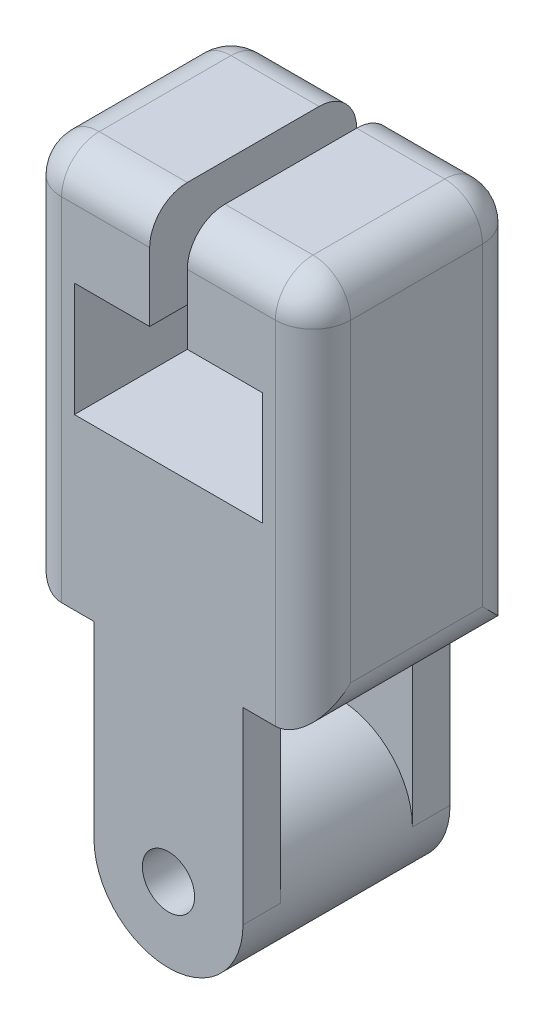
ISO-10303-21;
HEADER;
FILE_DESCRIPTION(('STEP AP214'),'2;1');
FILE_NAME('part.step','',(''),(''),'','','');
FILE_SCHEMA(('AUTOMOTIVE_DESIGN { 1 0 10303 214 1 1 1 1 }'));
ENDSEC;
DATA;
#1=APPLICATION_CONTEXT('core data for automotive mechanical design processes');
#2=APPLICATION_PROTOCOL_DEFINITION('international standard','automotive_design',2000,#1);
#3=PRODUCT_CONTEXT('',#1,'mechanical');
#4=PRODUCT('Part','Part','',(#3));
#5=PRODUCT_RELATED_PRODUCT_CATEGORY('part','',(#4));
#6=PRODUCT_DEFINITION_FORMATION('','',#4);
#7=PRODUCT_DEFINITION_CONTEXT('part definition',#1,'design');
#8=PRODUCT_DEFINITION('design','',#6,#7);
#9=PRODUCT_DEFINITION_SHAPE('','',#8);
#10=(LENGTH_UNIT() NAMED_UNIT(*) SI_UNIT(.MILLI.,.METRE.));
#11=(NAMED_UNIT(*) PLANE_ANGLE_UNIT() SI_UNIT($,.RADIAN.));
#12=(NAMED_UNIT(*) SI_UNIT($,.STERADIAN.) SOLID_ANGLE_UNIT());
#13=UNCERTAINTY_MEASURE_WITH_UNIT(LENGTH_MEASURE(1.E-05),#10,'distance_accuracy_value','');
#14=(GEOMETRIC_REPRESENTATION_CONTEXT(3) GLOBAL_UNCERTAINTY_ASSIGNED_CONTEXT((#13)) GLOBAL_UNIT_ASSIGNED_CONTEXT((#10,
#11,#12)) REPRESENTATION_CONTEXT('',''));
#15=CARTESIAN_POINT('',(0.,0.,0.));
#16=DIRECTION('',(0.,0.,1.));
#17=DIRECTION('',(1.,0.,0.));
#18=AXIS2_PLACEMENT_3D('',#15,#16,#17);
#19=CARTESIAN_POINT('',(0.,-131.318,69.85));
#20=DIRECTION('',(0.,1.,0.));
#21=DIRECTION('',(0.,0.,1.));
#22=AXIS2_PLACEMENT_3D('',#19,#20,#21);
#23=PLANE('',#22);
#24=DIRECTION('',(1.,0.,0.));
#25=VECTOR('',#24,1.);
#26=CARTESIAN_POINT('',(0.,-131.318,69.85));
#27=LINE('',#26,#25);
#28=CARTESIAN_POINT('',(12.7,-131.318,69.85));
#29=VERTEX_POINT('',#28);
#30=CARTESIAN_POINT('',(23.622,-131.318,69.85));
#31=VERTEX_POINT('',#30);
#32=EDGE_CURVE('E514',#29,#31,#27,.T.);
#33=ORIENTED_EDGE('',*,*,#32,.F.);
#34=DIRECTION('',(0.,0.,-1.));
#35=VECTOR('',#34,1.);
#36=CARTESIAN_POINT('',(12.7,-131.318,69.85));
#37=LINE('',#36,#35);
#38=CARTESIAN_POINT('',(12.7,-131.318,0.));
#39=VERTEX_POINT('',#38);
#40=EDGE_CURVE('E317',#29,#39,#37,.T.);
#41=ORIENTED_EDGE('',*,*,#40,.T.);
#42=DIRECTION('',(1.,0.,0.));
#43=VECTOR('',#42,1.);
#44=CARTESIAN_POINT('',(0.,-131.318,0.));
#45=LINE('',#44,#43);
#46=CARTESIAN_POINT('',(23.622,-131.318,0.));
#47=VERTEX_POINT('',#46);
#48=EDGE_CURVE('E564',#39,#47,#45,.T.);
#49=ORIENTED_EDGE('',*,*,#48,.T.);
#50=DIRECTION('',(0.,0.,-1.));
#51=VECTOR('',#50,1.);
#52=CARTESIAN_POINT('',(23.622,-131.318,0.));
#53=LINE('',#52,#51);
#54=CARTESIAN_POINT('',(23.622,-131.318,12.7));
#55=VERTEX_POINT('',#54);
#56=EDGE_CURVE('E604',#55,#47,#53,.T.);
#57=ORIENTED_EDGE('',*,*,#56,.F.);
#58=DIRECTION('',(-1.,0.,0.));
#59=VECTOR('',#58,1.);
#60=CARTESIAN_POINT('',(23.622,-131.318,12.7));
#61=LINE('',#60,#59);
#62=CARTESIAN_POINT('',(73.914,-131.318,12.7));
#63=VERTEX_POINT('',#62);
#64=EDGE_CURVE('E614',#63,#55,#61,.T.);
#65=ORIENTED_EDGE('',*,*,#64,.F.);
#66=DIRECTION('',(0.,0.,1.));
#67=VECTOR('',#66,1.);
#68=CARTESIAN_POINT('',(73.914,-131.318,12.7));
#69=LINE('',#68,#67);
#70=CARTESIAN_POINT('',(73.914,-131.318,0.));
#71=VERTEX_POINT('',#70);
#72=EDGE_CURVE('E606',#71,#63,#69,.T.);
#73=ORIENTED_EDGE('',*,*,#72,.F.);
#74=CARTESIAN_POINT('',(84.836,-131.318,0.));
#75=VERTEX_POINT('',#74);
#76=EDGE_CURVE('E255',#71,#75,#45,.T.);
#77=ORIENTED_EDGE('',*,*,#76,.T.);
#78=DIRECTION('',(0.,0.,-1.));
#79=VECTOR('',#78,1.);
#80=CARTESIAN_POINT('',(84.836,-131.318,69.85));
#81=LINE('',#80,#79);
#82=CARTESIAN_POINT('',(84.836,-131.318,69.85));
#83=VERTEX_POINT('',#82);
#84=EDGE_CURVE('E313',#75,#83,#81,.F.);
#85=ORIENTED_EDGE('',*,*,#84,.T.);
#86=CARTESIAN_POINT('',(73.914,-131.318,69.85));
#87=VERTEX_POINT('',#86);
#88=EDGE_CURVE('E510',#87,#83,#27,.T.);
#89=ORIENTED_EDGE('',*,*,#88,.F.);
#90=DIRECTION('',(0.,0.,1.));
#91=VECTOR('',#90,1.);
#92=CARTESIAN_POINT('',(73.914,-131.318,57.15));
#93=LINE('',#92,#91);
#94=CARTESIAN_POINT('',(73.914,-131.318,57.15));
#95=VERTEX_POINT('',#94);
#96=EDGE_CURVE('E250',#95,#87,#93,.T.);
#97=ORIENTED_EDGE('',*,*,#96,.F.);
#98=DIRECTION('',(1.,0.,0.));
#99=VECTOR('',#98,1.);
#100=CARTESIAN_POINT('',(23.622,-131.318,57.15));
#101=LINE('',#100,#99);
#102=CARTESIAN_POINT('',(23.622,-131.318,57.15));
#103=VERTEX_POINT('',#102);
#104=EDGE_CURVE('E264',#103,#95,#101,.T.);
#105=ORIENTED_EDGE('',*,*,#104,.F.);
#106=DIRECTION('',(0.,0.,-1.));
#107=VECTOR('',#106,1.);
#108=CARTESIAN_POINT('',(23.622,-131.318,69.85));
#109=LINE('',#108,#107);
#110=EDGE_CURVE('E641',#31,#103,#109,.T.);
#111=ORIENTED_EDGE('',*,*,#110,.F.);
#112=EDGE_LOOP('',(#33,#41,#49,#57,#65,#73,#77,#85,#89,#97,#105,#111));
#113=FACE_BOUND('',#112,.T.);
#114=ADVANCED_FACE('F55',(#113),#23,.F.);
#115=CARTESIAN_POINT('',(0.,0.,69.85));
#116=DIRECTION('',(1.,0.,0.));
#117=DIRECTION('',(0.,1.,0.));
#118=AXIS2_PLACEMENT_3D('',#115,#116,#117);
#119=PLANE('',#118);
#120=DIRECTION('',(0.,-1.,0.));
#121=VECTOR('',#120,1.);
#122=CARTESIAN_POINT('',(0.,0.,57.15));
#123=LINE('',#122,#121);
#124=CARTESIAN_POINT('',(0.,-118.618,57.15));
#125=VERTEX_POINT('',#124);
#126=CARTESIAN_POINT('',(0.,-12.7,57.15));
#127=VERTEX_POINT('',#126);
#128=EDGE_CURVE('E302',#125,#127,#123,.F.);
#129=ORIENTED_EDGE('',*,*,#128,.T.);
#130=DIRECTION('',(0.,0.,-1.));
#131=VECTOR('',#130,1.);
#132=CARTESIAN_POINT('',(0.,-12.7,69.85));
#133=LINE('',#132,#131);
#134=CARTESIAN_POINT('',(0.,-12.7,12.7));
#135=VERTEX_POINT('',#134);
#136=EDGE_CURVE('E309',#127,#135,#133,.T.);
#137=ORIENTED_EDGE('',*,*,#136,.T.);
#138=DIRECTION('',(0.,-1.,0.));
#139=VECTOR('',#138,1.);
#140=CARTESIAN_POINT('',(0.,0.,12.7));
#141=LINE('',#140,#139);
#142=CARTESIAN_POINT('',(0.,-118.618,12.7));
#143=VERTEX_POINT('',#142);
#144=EDGE_CURVE('E310',#135,#143,#141,.T.);
#145=ORIENTED_EDGE('',*,*,#144,.T.);
#146=DIRECTION('',(0.,0.,-1.));
#147=VECTOR('',#146,1.);
#148=CARTESIAN_POINT('',(0.,-118.618,69.85));
#149=LINE('',#148,#147);
#150=EDGE_CURVE('E301',#143,#125,#149,.F.);
#151=ORIENTED_EDGE('',*,*,#150,.T.);
#152=EDGE_LOOP('',(#129,#137,#145,#151));
#153=FACE_BOUND('',#152,.T.);
#154=ADVANCED_FACE('F679',(#153),#119,.F.);
#155=CARTESIAN_POINT('',(97.536,-131.318,69.85));
#156=DIRECTION('',(-1.,0.,0.));
#157=DIRECTION('',(0.,0.,1.));
#158=AXIS2_PLACEMENT_3D('',#155,#156,#157);
#159=PLANE('',#158);
#160=DIRECTION('',(0.,1.,0.));
#161=VECTOR('',#160,1.);
#162=CARTESIAN_POINT('',(97.536,-131.318,12.7));
#163=LINE('',#162,#161);
#164=CARTESIAN_POINT('',(97.536,-118.618,12.7));
#165=VERTEX_POINT('',#164);
#166=CARTESIAN_POINT('',(97.536,-12.7,12.7));
#167=VERTEX_POINT('',#166);
#168=EDGE_CURVE('E64',#165,#167,#163,.T.);
#169=ORIENTED_EDGE('',*,*,#168,.T.);
#170=DIRECTION('',(0.,0.,-1.));
#171=VECTOR('',#170,1.);
#172=CARTESIAN_POINT('',(97.536,-12.7,69.85));
#173=LINE('',#172,#171);
#174=CARTESIAN_POINT('',(97.536,-12.7,57.15));
#175=VERTEX_POINT('',#174);
#176=EDGE_CURVE('E12',#167,#175,#173,.F.);
#177=ORIENTED_EDGE('',*,*,#176,.T.);
#178=DIRECTION('',(0.,1.,0.));
#179=VECTOR('',#178,1.);
#180=CARTESIAN_POINT('',(97.536,-131.318,57.15));
#181=LINE('',#180,#179);
#182=CARTESIAN_POINT('',(97.536,-118.618,57.15));
#183=VERTEX_POINT('',#182);
#184=EDGE_CURVE('E322',#175,#183,#181,.F.);
#185=ORIENTED_EDGE('',*,*,#184,.T.);
#186=DIRECTION('',(0.,0.,-1.));
#187=VECTOR('',#186,1.);
#188=CARTESIAN_POINT('',(97.536,-118.618,69.85));
#189=LINE('',#188,#187);
#190=EDGE_CURVE('E318',#183,#165,#189,.T.);
#191=ORIENTED_EDGE('',*,*,#190,.T.);
#192=EDGE_LOOP('',(#169,#177,#185,#191));
#193=FACE_BOUND('',#192,.T.);
#194=ADVANCED_FACE('F681',(#193),#159,.F.);
#195=CARTESIAN_POINT('',(97.536,0.,69.85));
#196=DIRECTION('',(0.,-1.,0.));
#197=DIRECTION('',(1.,0.,0.));
#198=AXIS2_PLACEMENT_3D('',#195,#196,#197);
#199=PLANE('',#198);
#200=DIRECTION('',(0.,0.,-1.));
#201=VECTOR('',#200,1.);
#202=CARTESIAN_POINT('',(84.836,0.,69.85));
#203=LINE('',#202,#201);
#204=CARTESIAN_POINT('',(84.836,0.,57.15));
#205=VERTEX_POINT('',#204);
#206=CARTESIAN_POINT('',(84.836,0.,12.7));
#207=VERTEX_POINT('',#206);
#208=EDGE_CURVE('E415',#205,#207,#203,.T.);
#209=ORIENTED_EDGE('',*,*,#208,.T.);
#210=DIRECTION('',(-1.,0.,0.));
#211=VECTOR('',#210,1.);
#212=CARTESIAN_POINT('',(97.536,0.,12.7));
#213=LINE('',#212,#211);
#214=CARTESIAN_POINT('',(55.118,0.,12.7));
#215=VERTEX_POINT('',#214);
#216=EDGE_CURVE('E403',#207,#215,#213,.T.);
#217=ORIENTED_EDGE('',*,*,#216,.T.);
#218=DIRECTION('',(0.,0.,-1.));
#219=VECTOR('',#218,1.);
#220=CARTESIAN_POINT('',(55.118,0.,69.85));
#221=LINE('',#220,#219);
#222=CARTESIAN_POINT('',(55.118,0.,57.15));
#223=VERTEX_POINT('',#222);
#224=EDGE_CURVE('E442',#223,#215,#221,.T.);
#225=ORIENTED_EDGE('',*,*,#224,.F.);
#226=DIRECTION('',(-1.,0.,0.));
#227=VECTOR('',#226,1.);
#228=CARTESIAN_POINT('',(97.536,0.,57.15));
#229=LINE('',#228,#227);
#230=EDGE_CURVE('E410',#223,#205,#229,.F.);
#231=ORIENTED_EDGE('',*,*,#230,.T.);
#232=EDGE_LOOP('',(#209,#217,#225,#231));
#233=FACE_BOUND('',#232,.T.);
#234=ADVANCED_FACE('F745',(#233),#199,.F.);
#235=CARTESIAN_POINT('',(55.118,0.,69.85));
#236=DIRECTION('',(1.,0.,0.));
#237=DIRECTION('',(0.,0.,-1.));
#238=AXIS2_PLACEMENT_3D('',#235,#236,#237);
#239=PLANE('',#238);
#240=ORIENTED_EDGE('',*,*,#224,.T.);
#241=CARTESIAN_POINT('',(55.118,-12.7,12.7));
#242=DIRECTION('',(1.,0.,0.));
#243=DIRECTION('',(0.,0.,-1.));
#244=AXIS2_PLACEMENT_3D('',#241,#242,#243);
#245=CIRCLE('',#244,12.7);
#246=CARTESIAN_POINT('',(55.118,-12.7,0.));
#247=VERTEX_POINT('',#246);
#248=EDGE_CURVE('E399',#215,#247,#245,.F.);
#249=ORIENTED_EDGE('',*,*,#248,.T.);
#250=DIRECTION('',(0.,-1.,0.));
#251=VECTOR('',#250,1.);
#252=CARTESIAN_POINT('',(55.118,0.,0.));
#253=LINE('',#252,#251);
#254=CARTESIAN_POINT('',(55.118,-36.068,0.));
#255=VERTEX_POINT('',#254);
#256=EDGE_CURVE('E571',#247,#255,#253,.T.);
#257=ORIENTED_EDGE('',*,*,#256,.T.);
#258=DIRECTION('',(0.,0.,-1.));
#259=VECTOR('',#258,1.);
#260=CARTESIAN_POINT('',(55.118,-36.068,69.85));
#261=LINE('',#260,#259);
#262=CARTESIAN_POINT('',(55.118,-36.068,69.85));
#263=VERTEX_POINT('',#262);
#264=EDGE_CURVE('E450',#263,#255,#261,.T.);
#265=ORIENTED_EDGE('',*,*,#264,.F.);
#266=DIRECTION('',(0.,-1.,0.));
#267=VECTOR('',#266,1.);
#268=CARTESIAN_POINT('',(55.118,0.,69.85));
#269=LINE('',#268,#267);
#270=CARTESIAN_POINT('',(55.118,-12.7,69.85));
#271=VERTEX_POINT('',#270);
#272=EDGE_CURVE('E591',#271,#263,#269,.T.);
#273=ORIENTED_EDGE('',*,*,#272,.F.);
#274=CARTESIAN_POINT('',(55.118,-12.7,57.15));
#275=DIRECTION('',(1.,0.,0.));
#276=DIRECTION('',(0.,0.,-1.));
#277=AXIS2_PLACEMENT_3D('',#274,#275,#276);
#278=CIRCLE('',#277,12.7);
#279=EDGE_CURVE('E398',#271,#223,#278,.F.);
#280=ORIENTED_EDGE('',*,*,#279,.T.);
#281=EDGE_LOOP('',(#240,#249,#257,#265,#273,#280));
#282=FACE_BOUND('',#281,.T.);
#283=ADVANCED_FACE('F737',(#282),#239,.F.);
#284=CARTESIAN_POINT('',(55.118,-36.068,69.85));
#285=DIRECTION('',(0.,1.,0.));
#286=DIRECTION('',(0.,0.,1.));
#287=AXIS2_PLACEMENT_3D('',#284,#285,#286);
#288=PLANE('',#287);
#289=DIRECTION('',(1.,0.,0.));
#290=VECTOR('',#289,1.);
#291=CARTESIAN_POINT('',(55.118,-36.068,0.));
#292=LINE('',#291,#290);
#293=CARTESIAN_POINT('',(80.518,-36.068,0.));
#294=VERTEX_POINT('',#293);
#295=EDGE_CURVE('E472',#255,#294,#292,.T.);
#296=ORIENTED_EDGE('',*,*,#295,.T.);
#297=DIRECTION('',(0.,0.,-1.));
#298=VECTOR('',#297,1.);
#299=CARTESIAN_POINT('',(80.518,-36.068,69.85));
#300=LINE('',#299,#298);
#301=CARTESIAN_POINT('',(80.518,-36.068,69.85));
#302=VERTEX_POINT('',#301);
#303=EDGE_CURVE('E453',#302,#294,#300,.T.);
#304=ORIENTED_EDGE('',*,*,#303,.F.);
#305=DIRECTION('',(1.,0.,0.));
#306=VECTOR('',#305,1.);
#307=CARTESIAN_POINT('',(55.118,-36.068,69.85));
#308=LINE('',#307,#306);
#309=EDGE_CURVE('E587',#263,#302,#308,.T.);
#310=ORIENTED_EDGE('',*,*,#309,.F.);
#311=ORIENTED_EDGE('',*,*,#264,.T.);
#312=EDGE_LOOP('',(#296,#304,#310,#311));
#313=FACE_BOUND('',#312,.T.);
#314=ADVANCED_FACE('F752',(#313),#288,.F.);
#315=CARTESIAN_POINT('',(80.518,-36.068,69.85));
#316=DIRECTION('',(1.,0.,0.));
#317=DIRECTION('',(0.,0.,-1.));
#318=AXIS2_PLACEMENT_3D('',#315,#316,#317);
#319=PLANE('',#318);
#320=DIRECTION('',(0.,-1.,0.));
#321=VECTOR('',#320,1.);
#322=CARTESIAN_POINT('',(80.518,-36.068,0.));
#323=LINE('',#322,#321);
#324=CARTESIAN_POINT('',(80.518,-74.168,0.));
#325=VERTEX_POINT('',#324);
#326=EDGE_CURVE('E470',#294,#325,#323,.T.);
#327=ORIENTED_EDGE('',*,*,#326,.T.);
#328=DIRECTION('',(0.,0.,-1.));
#329=VECTOR('',#328,1.);
#330=CARTESIAN_POINT('',(80.518,-74.168,69.85));
#331=LINE('',#330,#329);
#332=CARTESIAN_POINT('',(80.518,-74.168,69.85));
#333=VERTEX_POINT('',#332);
#334=EDGE_CURVE('E458',#333,#325,#331,.T.);
#335=ORIENTED_EDGE('',*,*,#334,.F.);
#336=DIRECTION('',(0.,-1.,0.));
#337=VECTOR('',#336,1.);
#338=CARTESIAN_POINT('',(80.518,-36.068,69.85));
#339=LINE('',#338,#337);
#340=EDGE_CURVE('E590',#302,#333,#339,.T.);
#341=ORIENTED_EDGE('',*,*,#340,.F.);
#342=ORIENTED_EDGE('',*,*,#303,.T.);
#343=EDGE_LOOP('',(#327,#335,#341,#342));
#344=FACE_BOUND('',#343,.T.);
#345=ADVANCED_FACE('F757',(#344),#319,.F.);
#346=CARTESIAN_POINT('',(17.018,-74.168,69.85));
#347=DIRECTION('',(0.,-1.,0.));
#348=DIRECTION('',(0.,0.,-1.));
#349=AXIS2_PLACEMENT_3D('',#346,#347,#348);
#350=PLANE('',#349);
#351=DIRECTION('',(-1.,0.,0.));
#352=VECTOR('',#351,1.);
#353=CARTESIAN_POINT('',(17.018,-74.168,0.));
#354=LINE('',#353,#352);
#355=CARTESIAN_POINT('',(17.018,-74.168,0.));
#356=VERTEX_POINT('',#355);
#357=EDGE_CURVE('E474',#325,#356,#354,.T.);
#358=ORIENTED_EDGE('',*,*,#357,.T.);
#359=DIRECTION('',(0.,0.,-1.));
#360=VECTOR('',#359,1.);
#361=CARTESIAN_POINT('',(17.018,-74.168,69.85));
#362=LINE('',#361,#360);
#363=CARTESIAN_POINT('',(17.018,-74.168,69.85));
#364=VERTEX_POINT('',#363);
#365=EDGE_CURVE('E487',#364,#356,#362,.T.);
#366=ORIENTED_EDGE('',*,*,#365,.F.);
#367=DIRECTION('',(-1.,0.,0.));
#368=VECTOR('',#367,1.);
#369=CARTESIAN_POINT('',(17.018,-74.168,69.85));
#370=LINE('',#369,#368);
#371=EDGE_CURVE('E581',#333,#364,#370,.T.);
#372=ORIENTED_EDGE('',*,*,#371,.F.);
#373=ORIENTED_EDGE('',*,*,#334,.T.);
#374=EDGE_LOOP('',(#358,#366,#372,#373));
#375=FACE_BOUND('',#374,.T.);
#376=ADVANCED_FACE('F766',(#375),#350,.F.);
#377=CARTESIAN_POINT('',(17.018,-35.7449144536344,69.85));
#378=DIRECTION('',(-1.,0.,0.));
#379=DIRECTION('',(0.,-1.,0.));
#380=AXIS2_PLACEMENT_3D('',#377,#378,#379);
#381=PLANE('',#380);
#382=DIRECTION('',(0.,1.,0.));
#383=VECTOR('',#382,1.);
#384=CARTESIAN_POINT('',(17.018,-35.7449144536344,0.));
#385=LINE('',#384,#383);
#386=CARTESIAN_POINT('',(17.018,-35.7449144536344,0.));
#387=VERTEX_POINT('',#386);
#388=EDGE_CURVE('E476',#356,#387,#385,.T.);
#389=ORIENTED_EDGE('',*,*,#388,.T.);
#390=DIRECTION('',(0.,0.,-1.));
#391=VECTOR('',#390,1.);
#392=CARTESIAN_POINT('',(17.018,-35.7449144536344,69.85));
#393=LINE('',#392,#391);
#394=CARTESIAN_POINT('',(17.018,-35.7449144536344,69.85));
#395=VERTEX_POINT('',#394);
#396=EDGE_CURVE('E495',#395,#387,#393,.T.);
#397=ORIENTED_EDGE('',*,*,#396,.F.);
#398=DIRECTION('',(0.,1.,0.));
#399=VECTOR('',#398,1.);
#400=CARTESIAN_POINT('',(17.018,-35.7449144536344,69.85));
#401=LINE('',#400,#399);
#402=EDGE_CURVE('E584',#364,#395,#401,.T.);
#403=ORIENTED_EDGE('',*,*,#402,.F.);
#404=ORIENTED_EDGE('',*,*,#365,.T.);
#405=EDGE_LOOP('',(#389,#397,#403,#404));
#406=FACE_BOUND('',#405,.T.);
#407=ADVANCED_FACE('F767',(#406),#381,.F.);
#408=CARTESIAN_POINT('',(42.418,-35.7449144536344,69.85));
#409=DIRECTION('',(0.,1.,0.));
#410=DIRECTION('',(0.,0.,1.));
#411=AXIS2_PLACEMENT_3D('',#408,#409,#410);
#412=PLANE('',#411);
#413=DIRECTION('',(1.,0.,0.));
#414=VECTOR('',#413,1.);
#415=CARTESIAN_POINT('',(42.418,-35.7449144536344,0.));
#416=LINE('',#415,#414);
#417=CARTESIAN_POINT('',(42.418,-35.7449144536344,0.));
#418=VERTEX_POINT('',#417);
#419=EDGE_CURVE('E484',#387,#418,#416,.T.);
#420=ORIENTED_EDGE('',*,*,#419,.T.);
#421=DIRECTION('',(0.,0.,-1.));
#422=VECTOR('',#421,1.);
#423=CARTESIAN_POINT('',(42.418,-35.7449144536344,69.85));
#424=LINE('',#423,#422);
#425=CARTESIAN_POINT('',(42.418,-35.7449144536344,69.85));
#426=VERTEX_POINT('',#425);
#427=EDGE_CURVE('E496',#426,#418,#424,.T.);
#428=ORIENTED_EDGE('',*,*,#427,.F.);
#429=DIRECTION('',(1.,0.,0.));
#430=VECTOR('',#429,1.);
#431=CARTESIAN_POINT('',(42.418,-35.7449144536344,69.85));
#432=LINE('',#431,#430);
#433=EDGE_CURVE('E576',#395,#426,#432,.T.);
#434=ORIENTED_EDGE('',*,*,#433,.F.);
#435=ORIENTED_EDGE('',*,*,#396,.T.);
#436=EDGE_LOOP('',(#420,#428,#434,#435));
#437=FACE_BOUND('',#436,.T.);
#438=ADVANCED_FACE('F517',(#437),#412,.F.);
#439=CARTESIAN_POINT('',(42.418,0.,69.85));
#440=DIRECTION('',(-1.,0.,0.));
#441=DIRECTION('',(0.,0.,1.));
#442=AXIS2_PLACEMENT_3D('',#439,#440,#441);
#443=PLANE('',#442);
#444=DIRECTION('',(0.,1.,0.));
#445=VECTOR('',#444,1.);
#446=CARTESIAN_POINT('',(42.418,0.,0.));
#447=LINE('',#446,#445);
#448=CARTESIAN_POINT('',(42.418,-12.7,0.));
#449=VERTEX_POINT('',#448);
#450=EDGE_CURVE('E502',#418,#449,#447,.T.);
#451=ORIENTED_EDGE('',*,*,#450,.T.);
#452=CARTESIAN_POINT('',(42.418,-12.7,12.7));
#453=DIRECTION('',(-1.,0.,0.));
#454=DIRECTION('',(0.,0.,1.));
#455=AXIS2_PLACEMENT_3D('',#452,#453,#454);
#456=CIRCLE('',#455,12.7);
#457=CARTESIAN_POINT('',(42.418,0.,12.7));
#458=VERTEX_POINT('',#457);
#459=EDGE_CURVE('E412',#449,#458,#456,.F.);
#460=ORIENTED_EDGE('',*,*,#459,.T.);
#461=DIRECTION('',(0.,0.,-1.));
#462=VECTOR('',#461,1.);
#463=CARTESIAN_POINT('',(42.418,0.,69.85));
#464=LINE('',#463,#462);
#465=CARTESIAN_POINT('',(42.418,0.,57.15));
#466=VERTEX_POINT('',#465);
#467=EDGE_CURVE('E499',#466,#458,#464,.T.);
#468=ORIENTED_EDGE('',*,*,#467,.F.);
#469=CARTESIAN_POINT('',(42.418,-12.7,57.15));
#470=DIRECTION('',(-1.,0.,0.));
#471=DIRECTION('',(0.,0.,1.));
#472=AXIS2_PLACEMENT_3D('',#469,#470,#471);
#473=CIRCLE('',#472,12.7);
#474=CARTESIAN_POINT('',(42.418,-12.7,69.85));
#475=VERTEX_POINT('',#474);
#476=EDGE_CURVE('E420',#466,#475,#473,.F.);
#477=ORIENTED_EDGE('',*,*,#476,.T.);
#478=DIRECTION('',(0.,1.,0.));
#479=VECTOR('',#478,1.);
#480=CARTESIAN_POINT('',(42.418,0.,69.85));
#481=LINE('',#480,#479);
#482=EDGE_CURVE('E503',#426,#475,#481,.T.);
#483=ORIENTED_EDGE('',*,*,#482,.F.);
#484=ORIENTED_EDGE('',*,*,#427,.T.);
#485=EDGE_LOOP('',(#451,#460,#468,#477,#483,#484));
#486=FACE_BOUND('',#485,.T.);
#487=ADVANCED_FACE('F524',(#486),#443,.F.);
#488=CARTESIAN_POINT('',(0.,0.,69.85));
#489=DIRECTION('',(0.,-1.,0.));
#490=DIRECTION('',(0.,0.,-1.));
#491=AXIS2_PLACEMENT_3D('',#488,#489,#490);
#492=PLANE('',#491);
#493=ORIENTED_EDGE('',*,*,#467,.T.);
#494=DIRECTION('',(-1.,0.,0.));
#495=VECTOR('',#494,1.);
#496=CARTESIAN_POINT('',(0.,0.,12.7));
#497=LINE('',#496,#495);
#498=CARTESIAN_POINT('',(12.7,0.,12.7));
#499=VERTEX_POINT('',#498);
#500=EDGE_CURVE('E433',#458,#499,#497,.T.);
#501=ORIENTED_EDGE('',*,*,#500,.T.);
#502=DIRECTION('',(0.,0.,-1.));
#503=VECTOR('',#502,1.);
#504=CARTESIAN_POINT('',(12.7,0.,69.85));
#505=LINE('',#504,#503);
#506=CARTESIAN_POINT('',(12.7,0.,57.15));
#507=VERTEX_POINT('',#506);
#508=EDGE_CURVE('E439',#499,#507,#505,.F.);
#509=ORIENTED_EDGE('',*,*,#508,.T.);
#510=DIRECTION('',(-1.,0.,0.));
#511=VECTOR('',#510,1.);
#512=CARTESIAN_POINT('',(42.418,0.,57.15));
#513=LINE('',#512,#511);
#514=EDGE_CURVE('E440',#507,#466,#513,.F.);
#515=ORIENTED_EDGE('',*,*,#514,.T.);
#516=EDGE_LOOP('',(#493,#501,#509,#515));
#517=FACE_BOUND('',#516,.T.);
#518=ADVANCED_FACE('F542',(#517),#492,.F.);
#519=CARTESIAN_POINT('',(0.,0.,69.85));
#520=DIRECTION('',(0.,0.,1.));
#521=DIRECTION('',(1.,0.,0.));
#522=AXIS2_PLACEMENT_3D('',#519,#520,#521);
#523=PLANE('',#522);
#524=CARTESIAN_POINT('',(48.768,-194.818,69.85));
#525=DIRECTION('',(0.,0.,1.));
#526=DIRECTION('',(1.,0.,0.));
#527=AXIS2_PLACEMENT_3D('',#524,#525,#526);
#528=CIRCLE('',#527,8.80852099816562);
#529=CARTESIAN_POINT('',(57.5765209981657,-194.818,69.85));
#530=VERTEX_POINT('',#529);
#531=EDGE_CURVE('E276',#530,#530,#528,.T.);
#532=ORIENTED_EDGE('',*,*,#531,.F.);
#533=EDGE_LOOP('',(#532));
#534=FACE_BOUND('',#533,.T.);
#535=ORIENTED_EDGE('',*,*,#482,.T.);
#536=DIRECTION('',(-1.,0.,0.));
#537=VECTOR('',#536,1.);
#538=CARTESIAN_POINT('',(0.,-12.7,69.85));
#539=LINE('',#538,#537);
#540=CARTESIAN_POINT('',(12.7,-12.7,69.85));
#541=VERTEX_POINT('',#540);
#542=EDGE_CURVE('E298',#475,#541,#539,.T.);
#543=ORIENTED_EDGE('',*,*,#542,.T.);
#544=DIRECTION('',(0.,-1.,0.));
#545=VECTOR('',#544,1.);
#546=CARTESIAN_POINT('',(12.7,-131.318,69.85));
#547=LINE('',#546,#545);
#548=EDGE_CURVE('E293',#541,#29,#547,.T.);
#549=ORIENTED_EDGE('',*,*,#548,.T.);
#550=ORIENTED_EDGE('',*,*,#32,.T.);
#551=DIRECTION('',(0.,1.,0.));
#552=VECTOR('',#551,1.);
#553=CARTESIAN_POINT('',(23.622,-194.818,69.85));
#554=LINE('',#553,#552);
#555=CARTESIAN_POINT('',(23.622,-194.818,69.85));
#556=VERTEX_POINT('',#555);
#557=EDGE_CURVE('E254',#556,#31,#554,.T.);
#558=ORIENTED_EDGE('',*,*,#557,.F.);
#559=CARTESIAN_POINT('',(48.768,-194.818,69.85));
#560=DIRECTION('',(0.,0.,-1.));
#561=DIRECTION('',(-1.,0.,0.));
#562=AXIS2_PLACEMENT_3D('',#559,#560,#561);
#563=CIRCLE('',#562,25.146);
#564=CARTESIAN_POINT('',(73.914,-194.818,69.85));
#565=VERTEX_POINT('',#564);
#566=EDGE_CURVE('E256',#565,#556,#563,.T.);
#567=ORIENTED_EDGE('',*,*,#566,.F.);
#568=DIRECTION('',(0.,1.,0.));
#569=VECTOR('',#568,1.);
#570=CARTESIAN_POINT('',(73.914,-194.818,69.85));
#571=LINE('',#570,#569);
#572=EDGE_CURVE('E241',#565,#87,#571,.T.);
#573=ORIENTED_EDGE('',*,*,#572,.T.);
#574=ORIENTED_EDGE('',*,*,#88,.T.);
#575=DIRECTION('',(0.,1.,0.));
#576=VECTOR('',#575,1.);
#577=CARTESIAN_POINT('',(84.836,0.,69.85));
#578=LINE('',#577,#576);
#579=CARTESIAN_POINT('',(84.836,-12.7,69.85));
#580=VERTEX_POINT('',#579);
#581=EDGE_CURVE('E394',#83,#580,#578,.T.);
#582=ORIENTED_EDGE('',*,*,#581,.T.);
#583=DIRECTION('',(-1.,0.,0.));
#584=VECTOR('',#583,1.);
#585=CARTESIAN_POINT('',(55.118,-12.7,69.85));
#586=LINE('',#585,#584);
#587=EDGE_CURVE('E300',#580,#271,#586,.T.);
#588=ORIENTED_EDGE('',*,*,#587,.T.);
#589=ORIENTED_EDGE('',*,*,#272,.T.);
#590=ORIENTED_EDGE('',*,*,#309,.T.);
#591=ORIENTED_EDGE('',*,*,#340,.T.);
#592=ORIENTED_EDGE('',*,*,#371,.T.);
#593=ORIENTED_EDGE('',*,*,#402,.T.);
#594=ORIENTED_EDGE('',*,*,#433,.T.);
#595=EDGE_LOOP('',(#535,#543,#549,#550,#558,#567,#573,#574,#582,#588,#589,#590,#591,#592,#593,#594));
#596=FACE_BOUND('',#595,.T.);
#597=ADVANCED_FACE('F267',(#534,#596),#523,.T.);
#598=CARTESIAN_POINT('',(0.,0.,0.));
#599=DIRECTION('',(0.,0.,1.));
#600=DIRECTION('',(1.,0.,0.));
#601=AXIS2_PLACEMENT_3D('',#598,#599,#600);
#602=PLANE('',#601);
#603=CARTESIAN_POINT('',(48.768,-194.818,0.));
#604=DIRECTION('',(0.,0.,1.));
#605=DIRECTION('',(1.,0.,0.));
#606=AXIS2_PLACEMENT_3D('',#603,#604,#605);
#607=CIRCLE('',#606,8.80852099816562);
#608=CARTESIAN_POINT('',(57.5765209981657,-194.818,0.));
#609=VERTEX_POINT('',#608);
#610=EDGE_CURVE('E279',#609,#609,#607,.T.);
#611=ORIENTED_EDGE('',*,*,#610,.T.);
#612=EDGE_LOOP('',(#611));
#613=FACE_BOUND('',#612,.T.);
#614=DIRECTION('',(0.,-1.,0.));
#615=VECTOR('',#614,1.);
#616=CARTESIAN_POINT('',(12.7,0.,0.));
#617=LINE('',#616,#615);
#618=CARTESIAN_POINT('',(12.7,-12.7,0.));
#619=VERTEX_POINT('',#618);
#620=EDGE_CURVE('E425',#39,#619,#617,.F.);
#621=ORIENTED_EDGE('',*,*,#620,.T.);
#622=DIRECTION('',(-1.,0.,0.));
#623=VECTOR('',#622,1.);
#624=CARTESIAN_POINT('',(0.,-12.7,0.));
#625=LINE('',#624,#623);
#626=EDGE_CURVE('E423',#619,#449,#625,.F.);
#627=ORIENTED_EDGE('',*,*,#626,.T.);
#628=ORIENTED_EDGE('',*,*,#450,.F.);
#629=ORIENTED_EDGE('',*,*,#419,.F.);
#630=ORIENTED_EDGE('',*,*,#388,.F.);
#631=ORIENTED_EDGE('',*,*,#357,.F.);
#632=ORIENTED_EDGE('',*,*,#326,.F.);
#633=ORIENTED_EDGE('',*,*,#295,.F.);
#634=ORIENTED_EDGE('',*,*,#256,.F.);
#635=DIRECTION('',(-1.,0.,0.));
#636=VECTOR('',#635,1.);
#637=CARTESIAN_POINT('',(0.,-12.7,0.));
#638=LINE('',#637,#636);
#639=CARTESIAN_POINT('',(84.836,-12.7,0.));
#640=VERTEX_POINT('',#639);
#641=EDGE_CURVE('E430',#247,#640,#638,.F.);
#642=ORIENTED_EDGE('',*,*,#641,.T.);
#643=DIRECTION('',(0.,1.,0.));
#644=VECTOR('',#643,1.);
#645=CARTESIAN_POINT('',(84.836,0.,0.));
#646=LINE('',#645,#644);
#647=EDGE_CURVE('E427',#640,#75,#646,.F.);
#648=ORIENTED_EDGE('',*,*,#647,.T.);
#649=ORIENTED_EDGE('',*,*,#76,.F.);
#650=DIRECTION('',(0.,1.,0.));
#651=VECTOR('',#650,1.);
#652=CARTESIAN_POINT('',(73.914,-194.818,0.));
#653=LINE('',#652,#651);
#654=CARTESIAN_POINT('',(73.914,-194.818,0.));
#655=VERTEX_POINT('',#654);
#656=EDGE_CURVE('E610',#655,#71,#653,.T.);
#657=ORIENTED_EDGE('',*,*,#656,.F.);
#658=CARTESIAN_POINT('',(48.768,-194.818,0.));
#659=DIRECTION('',(0.,0.,-1.));
#660=DIRECTION('',(-1.,0.,0.));
#661=AXIS2_PLACEMENT_3D('',#658,#659,#660);
#662=CIRCLE('',#661,25.146);
#663=CARTESIAN_POINT('',(23.622,-194.818,0.));
#664=VERTEX_POINT('',#663);
#665=EDGE_CURVE('E268',#655,#664,#662,.T.);
#666=ORIENTED_EDGE('',*,*,#665,.T.);
#667=DIRECTION('',(0.,1.,0.));
#668=VECTOR('',#667,1.);
#669=CARTESIAN_POINT('',(23.622,-194.818,0.));
#670=LINE('',#669,#668);
#671=EDGE_CURVE('E567',#664,#47,#670,.T.);
#672=ORIENTED_EDGE('',*,*,#671,.T.);
#673=ORIENTED_EDGE('',*,*,#48,.F.);
#674=EDGE_LOOP('',(#621,#627,#628,#629,#630,#631,#632,#633,#634,#642,#648,#649,#657,#666,#672,#673));
#675=FACE_BOUND('',#674,.T.);
#676=ADVANCED_FACE('F522',(#613,#675),#602,.F.);
#677=CARTESIAN_POINT('',(73.914,-194.818,12.7));
#678=DIRECTION('',(-1.,0.,0.));
#679=DIRECTION('',(0.,0.,1.));
#680=AXIS2_PLACEMENT_3D('',#677,#678,#679);
#681=PLANE('',#680);
#682=ORIENTED_EDGE('',*,*,#72,.T.);
#683=DIRECTION('',(0.,1.,0.));
#684=VECTOR('',#683,1.);
#685=CARTESIAN_POINT('',(73.914,-194.818,12.7));
#686=LINE('',#685,#684);
#687=CARTESIAN_POINT('',(73.914,-194.818,12.7));
#688=VERTEX_POINT('',#687);
#689=EDGE_CURVE('E630',#688,#63,#686,.T.);
#690=ORIENTED_EDGE('',*,*,#689,.F.);
#691=DIRECTION('',(0.,0.,1.));
#692=VECTOR('',#691,1.);
#693=CARTESIAN_POINT('',(73.914,-194.818,12.7));
#694=LINE('',#693,#692);
#695=EDGE_CURVE('E596',#655,#688,#694,.T.);
#696=ORIENTED_EDGE('',*,*,#695,.F.);
#697=ORIENTED_EDGE('',*,*,#656,.T.);
#698=EDGE_LOOP('',(#682,#690,#696,#697));
#699=FACE_BOUND('',#698,.T.);
#700=ADVANCED_FACE('F658',(#699),#681,.F.);
#701=CARTESIAN_POINT('',(23.622,-194.818,12.7));
#702=DIRECTION('',(0.,0.,-1.));
#703=DIRECTION('',(-1.,0.,0.));
#704=AXIS2_PLACEMENT_3D('',#701,#702,#703);
#705=PLANE('',#704);
#706=DIRECTION('',(0.,1.,0.));
#707=VECTOR('',#706,1.);
#708=CARTESIAN_POINT('',(23.622,-194.818,12.7));
#709=LINE('',#708,#707);
#710=CARTESIAN_POINT('',(23.622,-194.818,12.7));
#711=VERTEX_POINT('',#710);
#712=EDGE_CURVE('E621',#711,#55,#709,.T.);
#713=ORIENTED_EDGE('',*,*,#712,.F.);
#714=CARTESIAN_POINT('',(48.768,-194.818,12.7));
#715=DIRECTION('',(0.,0.,-1.));
#716=DIRECTION('',(-1.,0.,0.));
#717=AXIS2_PLACEMENT_3D('',#714,#715,#716);
#718=CIRCLE('',#717,25.146);
#719=EDGE_CURVE('E274',#711,#688,#718,.T.);
#720=ORIENTED_EDGE('',*,*,#719,.T.);
#721=ORIENTED_EDGE('',*,*,#689,.T.);
#722=ORIENTED_EDGE('',*,*,#64,.T.);
#723=EDGE_LOOP('',(#713,#720,#721,#722));
#724=FACE_BOUND('',#723,.T.);
#725=ADVANCED_FACE('F657',(#724),#705,.F.);
#726=CARTESIAN_POINT('',(23.622,-194.818,0.));
#727=DIRECTION('',(1.,0.,0.));
#728=DIRECTION('',(0.,0.,-1.));
#729=AXIS2_PLACEMENT_3D('',#726,#727,#728);
#730=PLANE('',#729);
#731=ORIENTED_EDGE('',*,*,#56,.T.);
#732=ORIENTED_EDGE('',*,*,#671,.F.);
#733=DIRECTION('',(0.,0.,-1.));
#734=VECTOR('',#733,1.);
#735=CARTESIAN_POINT('',(23.622,-194.818,0.));
#736=LINE('',#735,#734);
#737=EDGE_CURVE('E602',#711,#664,#736,.T.);
#738=ORIENTED_EDGE('',*,*,#737,.F.);
#739=ORIENTED_EDGE('',*,*,#712,.T.);
#740=EDGE_LOOP('',(#731,#732,#738,#739));
#741=FACE_BOUND('',#740,.T.);
#742=ADVANCED_FACE('F663',(#741),#730,.F.);
#743=CARTESIAN_POINT('',(73.914,-194.818,57.15));
#744=DIRECTION('',(-1.,0.,0.));
#745=DIRECTION('',(0.,0.,1.));
#746=AXIS2_PLACEMENT_3D('',#743,#744,#745);
#747=PLANE('',#746);
#748=ORIENTED_EDGE('',*,*,#96,.T.);
#749=ORIENTED_EDGE('',*,*,#572,.F.);
#750=DIRECTION('',(0.,0.,1.));
#751=VECTOR('',#750,1.);
#752=CARTESIAN_POINT('',(73.914,-194.818,57.15));
#753=LINE('',#752,#751);
#754=CARTESIAN_POINT('',(73.914,-194.818,57.15));
#755=VERTEX_POINT('',#754);
#756=EDGE_CURVE('E244',#755,#565,#753,.T.);
#757=ORIENTED_EDGE('',*,*,#756,.F.);
#758=DIRECTION('',(0.,1.,0.));
#759=VECTOR('',#758,1.);
#760=CARTESIAN_POINT('',(73.914,-194.818,57.15));
#761=LINE('',#760,#759);
#762=EDGE_CURVE('E640',#755,#95,#761,.T.);
#763=ORIENTED_EDGE('',*,*,#762,.T.);
#764=EDGE_LOOP('',(#748,#749,#757,#763));
#765=FACE_BOUND('',#764,.T.);
#766=ADVANCED_FACE('F243',(#765),#747,.F.);
#767=CARTESIAN_POINT('',(23.622,-194.818,69.85));
#768=DIRECTION('',(1.,0.,0.));
#769=DIRECTION('',(0.,0.,-1.));
#770=AXIS2_PLACEMENT_3D('',#767,#768,#769);
#771=PLANE('',#770);
#772=ORIENTED_EDGE('',*,*,#110,.T.);
#773=DIRECTION('',(0.,1.,0.));
#774=VECTOR('',#773,1.);
#775=CARTESIAN_POINT('',(23.622,-194.818,57.15));
#776=LINE('',#775,#774);
#777=CARTESIAN_POINT('',(23.622,-194.818,57.15));
#778=VERTEX_POINT('',#777);
#779=EDGE_CURVE('E632',#778,#103,#776,.T.);
#780=ORIENTED_EDGE('',*,*,#779,.F.);
#781=DIRECTION('',(0.,0.,-1.));
#782=VECTOR('',#781,1.);
#783=CARTESIAN_POINT('',(23.622,-194.818,69.85));
#784=LINE('',#783,#782);
#785=EDGE_CURVE('E261',#556,#778,#784,.T.);
#786=ORIENTED_EDGE('',*,*,#785,.F.);
#787=ORIENTED_EDGE('',*,*,#557,.T.);
#788=EDGE_LOOP('',(#772,#780,#786,#787));
#789=FACE_BOUND('',#788,.T.);
#790=ADVANCED_FACE('F673',(#789),#771,.F.);
#791=CARTESIAN_POINT('',(23.622,-194.818,57.15));
#792=DIRECTION('',(0.,0.,1.));
#793=DIRECTION('',(1.,0.,0.));
#794=AXIS2_PLACEMENT_3D('',#791,#792,#793);
#795=PLANE('',#794);
#796=ORIENTED_EDGE('',*,*,#762,.F.);
#797=CARTESIAN_POINT('',(48.768,-194.818,57.15));
#798=DIRECTION('',(0.,0.,1.));
#799=DIRECTION('',(1.,0.,0.));
#800=AXIS2_PLACEMENT_3D('',#797,#798,#799);
#801=CIRCLE('',#800,25.146);
#802=EDGE_CURVE('E263',#755,#778,#801,.T.);
#803=ORIENTED_EDGE('',*,*,#802,.T.);
#804=ORIENTED_EDGE('',*,*,#779,.T.);
#805=ORIENTED_EDGE('',*,*,#104,.T.);
#806=EDGE_LOOP('',(#796,#803,#804,#805));
#807=FACE_BOUND('',#806,.T.);
#808=ADVANCED_FACE('F818',(#807),#795,.F.);
#809=CARTESIAN_POINT('',(48.768,-194.818,69.85));
#810=DIRECTION('',(0.,0.,-1.));
#811=DIRECTION('',(-1.,0.,0.));
#812=AXIS2_PLACEMENT_3D('',#809,#810,#811);
#813=CYLINDRICAL_SURFACE('',#812,25.146);
#814=ORIENTED_EDGE('',*,*,#566,.T.);
#815=ORIENTED_EDGE('',*,*,#785,.T.);
#816=ORIENTED_EDGE('',*,*,#802,.F.);
#817=ORIENTED_EDGE('',*,*,#756,.T.);
#818=EDGE_LOOP('',(#814,#815,#816,#817));
#819=FACE_BOUND('',#818,.T.);
#820=ORIENTED_EDGE('',*,*,#695,.T.);
#821=ORIENTED_EDGE('',*,*,#719,.F.);
#822=ORIENTED_EDGE('',*,*,#737,.T.);
#823=ORIENTED_EDGE('',*,*,#665,.F.);
#824=EDGE_LOOP('',(#820,#821,#822,#823));
#825=FACE_BOUND('',#824,.T.);
#826=ADVANCED_FACE('F259',(#819,#825),#813,.T.);
#827=CARTESIAN_POINT('',(48.768,-194.818,0.));
#828=DIRECTION('',(0.,0.,1.));
#829=DIRECTION('',(1.,0.,0.));
#830=AXIS2_PLACEMENT_3D('',#827,#828,#829);
#831=CYLINDRICAL_SURFACE('',#830,8.80852099816562);
#832=ORIENTED_EDGE('',*,*,#610,.F.);
#833=EDGE_LOOP('',(#832));
#834=FACE_BOUND('',#833,.T.);
#835=ORIENTED_EDGE('',*,*,#531,.T.);
#836=EDGE_LOOP('',(#835));
#837=FACE_BOUND('',#836,.T.);
#838=ADVANCED_FACE('F709',(#834,#837),#831,.F.);
#839=CARTESIAN_POINT('',(0.,-12.7,57.15));
#840=DIRECTION('',(1.,0.,0.));
#841=DIRECTION('',(0.,0.,-1.));
#842=AXIS2_PLACEMENT_3D('',#839,#840,#841);
#843=CYLINDRICAL_SURFACE('',#842,12.7);
#844=ORIENTED_EDGE('',*,*,#476,.F.);
#845=ORIENTED_EDGE('',*,*,#514,.F.);
#846=CARTESIAN_POINT('',(12.7,-12.7,57.15));
#847=DIRECTION('',(-1.,0.,0.));
#848=DIRECTION('',(0.,0.,1.));
#849=AXIS2_PLACEMENT_3D('',#846,#847,#848);
#850=CIRCLE('',#849,12.7);
#851=EDGE_CURVE('E351',#541,#507,#850,.T.);
#852=ORIENTED_EDGE('',*,*,#851,.F.);
#853=ORIENTED_EDGE('',*,*,#542,.F.);
#854=EDGE_LOOP('',(#844,#845,#852,#853));
#855=FACE_BOUND('',#854,.T.);
#856=ADVANCED_FACE('F548',(#855),#843,.T.);
#857=CARTESIAN_POINT('',(12.7,0.,57.15));
#858=DIRECTION('',(0.,1.,0.));
#859=DIRECTION('',(-1.,0.,0.));
#860=AXIS2_PLACEMENT_3D('',#857,#858,#859);
#861=CYLINDRICAL_SURFACE('',#860,12.7);
#862=CARTESIAN_POINT('',(12.7,-118.618,57.15));
#863=DIRECTION('',(0.,-0.707106781186547,-0.707106781186547));
#864=DIRECTION('',(0.,0.707106781186547,-0.707106781186547));
#865=AXIS2_PLACEMENT_3D('',#862,#863,#864);
#866=ELLIPSE('',#865,17.9605122421383,12.7);
#867=EDGE_CURVE('E348',#29,#125,#866,.T.);
#868=ORIENTED_EDGE('',*,*,#867,.F.);
#869=ORIENTED_EDGE('',*,*,#548,.F.);
#870=CARTESIAN_POINT('',(12.7,-12.7,57.15));
#871=DIRECTION('',(0.,1.,0.));
#872=DIRECTION('',(-1.,0.,0.));
#873=AXIS2_PLACEMENT_3D('',#870,#871,#872);
#874=CIRCLE('',#873,12.7);
#875=EDGE_CURVE('E347',#127,#541,#874,.T.);
#876=ORIENTED_EDGE('',*,*,#875,.F.);
#877=ORIENTED_EDGE('',*,*,#128,.F.);
#878=EDGE_LOOP('',(#868,#869,#876,#877));
#879=FACE_BOUND('',#878,.T.);
#880=ADVANCED_FACE('F560',(#879),#861,.T.);
#881=CARTESIAN_POINT('',(12.7,-12.7,57.15));
#882=DIRECTION('',(0.,0.,1.));
#883=DIRECTION('',(1.,0.,0.));
#884=AXIS2_PLACEMENT_3D('',#881,#882,#883);
#885=SPHERICAL_SURFACE('',#884,12.7);
#886=ORIENTED_EDGE('',*,*,#875,.T.);
#887=ORIENTED_EDGE('',*,*,#851,.T.);
#888=CARTESIAN_POINT('',(12.7,-12.7,57.15));
#889=DIRECTION('',(0.,0.,1.));
#890=DIRECTION('',(1.,0.,0.));
#891=AXIS2_PLACEMENT_3D('',#888,#889,#890);
#892=CIRCLE('',#891,12.7);
#893=EDGE_CURVE('E344',#127,#507,#892,.F.);
#894=ORIENTED_EDGE('',*,*,#893,.F.);
#895=EDGE_LOOP('',(#886,#887,#894));
#896=FACE_BOUND('',#895,.T.);
#897=ADVANCED_FACE('F699',(#896),#885,.T.);
#898=CARTESIAN_POINT('',(12.7,-118.618,69.85));
#899=DIRECTION('',(0.,0.,-1.));
#900=DIRECTION('',(-1.,0.,0.));
#901=AXIS2_PLACEMENT_3D('',#898,#899,#900);
#902=CYLINDRICAL_SURFACE('',#901,12.7);
#903=ORIENTED_EDGE('',*,*,#867,.T.);
#904=ORIENTED_EDGE('',*,*,#150,.F.);
#905=CARTESIAN_POINT('',(12.7,-118.618,12.7));
#906=DIRECTION('',(0.,0.707106781186547,-0.707106781186547));
#907=DIRECTION('',(0.,-0.707106781186547,-0.707106781186547));
#908=AXIS2_PLACEMENT_3D('',#905,#906,#907);
#909=ELLIPSE('',#908,17.9605122421383,12.7);
#910=EDGE_CURVE('E336',#39,#143,#909,.T.);
#911=ORIENTED_EDGE('',*,*,#910,.F.);
#912=ORIENTED_EDGE('',*,*,#40,.F.);
#913=EDGE_LOOP('',(#903,#904,#911,#912));
#914=FACE_BOUND('',#913,.T.);
#915=ADVANCED_FACE('F563',(#914),#902,.T.);
#916=CARTESIAN_POINT('',(12.7,-12.7,69.85));
#917=DIRECTION('',(0.,0.,-1.));
#918=DIRECTION('',(-1.,0.,0.));
#919=AXIS2_PLACEMENT_3D('',#916,#917,#918);
#920=CYLINDRICAL_SURFACE('',#919,12.7);
#921=ORIENTED_EDGE('',*,*,#893,.T.);
#922=ORIENTED_EDGE('',*,*,#508,.F.);
#923=CARTESIAN_POINT('',(12.7,-12.7,12.7));
#924=DIRECTION('',(0.,0.,-1.));
#925=DIRECTION('',(-1.,0.,0.));
#926=AXIS2_PLACEMENT_3D('',#923,#924,#925);
#927=CIRCLE('',#926,12.7);
#928=EDGE_CURVE('E331',#135,#499,#927,.T.);
#929=ORIENTED_EDGE('',*,*,#928,.F.);
#930=ORIENTED_EDGE('',*,*,#136,.F.);
#931=EDGE_LOOP('',(#921,#922,#929,#930));
#932=FACE_BOUND('',#931,.T.);
#933=ADVANCED_FACE('F543',(#932),#920,.T.);
#934=CARTESIAN_POINT('',(12.7,0.,12.7));
#935=DIRECTION('',(0.,-1.,0.));
#936=DIRECTION('',(1.,0.,0.));
#937=AXIS2_PLACEMENT_3D('',#934,#935,#936);
#938=CYLINDRICAL_SURFACE('',#937,12.7);
#939=ORIENTED_EDGE('',*,*,#910,.T.);
#940=ORIENTED_EDGE('',*,*,#144,.F.);
#941=CARTESIAN_POINT('',(12.7,-12.7,12.7));
#942=DIRECTION('',(0.,1.,0.));
#943=DIRECTION('',(-1.,0.,0.));
#944=AXIS2_PLACEMENT_3D('',#941,#942,#943);
#945=CIRCLE('',#944,12.7);
#946=EDGE_CURVE('E332',#619,#135,#945,.T.);
#947=ORIENTED_EDGE('',*,*,#946,.F.);
#948=ORIENTED_EDGE('',*,*,#620,.F.);
#949=EDGE_LOOP('',(#939,#940,#947,#948));
#950=FACE_BOUND('',#949,.T.);
#951=ADVANCED_FACE('F693',(#950),#938,.T.);
#952=CARTESIAN_POINT('',(12.7,-12.7,12.7));
#953=DIRECTION('',(-1.,0.,0.));
#954=DIRECTION('',(0.,0.,1.));
#955=AXIS2_PLACEMENT_3D('',#952,#953,#954);
#956=SPHERICAL_SURFACE('',#955,12.7);
#957=ORIENTED_EDGE('',*,*,#946,.T.);
#958=ORIENTED_EDGE('',*,*,#928,.T.);
#959=CARTESIAN_POINT('',(12.7,-12.7,12.7));
#960=DIRECTION('',(-1.,0.,0.));
#961=DIRECTION('',(0.,0.,1.));
#962=AXIS2_PLACEMENT_3D('',#959,#960,#961);
#963=CIRCLE('',#962,12.7);
#964=EDGE_CURVE('E326',#619,#499,#963,.F.);
#965=ORIENTED_EDGE('',*,*,#964,.F.);
#966=EDGE_LOOP('',(#957,#958,#965));
#967=FACE_BOUND('',#966,.T.);
#968=ADVANCED_FACE('F533',(#967),#956,.T.);
#969=CARTESIAN_POINT('',(0.,-12.7,12.7));
#970=DIRECTION('',(-1.,0.,0.));
#971=DIRECTION('',(0.,0.,1.));
#972=AXIS2_PLACEMENT_3D('',#969,#970,#971);
#973=CYLINDRICAL_SURFACE('',#972,12.7);
#974=ORIENTED_EDGE('',*,*,#459,.F.);
#975=ORIENTED_EDGE('',*,*,#626,.F.);
#976=ORIENTED_EDGE('',*,*,#964,.T.);
#977=ORIENTED_EDGE('',*,*,#500,.F.);
#978=EDGE_LOOP('',(#974,#975,#976,#977));
#979=FACE_BOUND('',#978,.T.);
#980=ADVANCED_FACE('F535',(#979),#973,.T.);
#981=CARTESIAN_POINT('',(84.836,0.,57.15));
#982=DIRECTION('',(0.,-1.,0.));
#983=DIRECTION('',(0.,0.,-1.));
#984=AXIS2_PLACEMENT_3D('',#981,#982,#983);
#985=CYLINDRICAL_SURFACE('',#984,12.7);
#986=CARTESIAN_POINT('',(84.836,-12.7,57.15));
#987=DIRECTION('',(0.,1.,0.));
#988=DIRECTION('',(0.,0.,1.));
#989=AXIS2_PLACEMENT_3D('',#986,#987,#988);
#990=CIRCLE('',#989,12.7);
#991=EDGE_CURVE('E378',#580,#175,#990,.T.);
#992=ORIENTED_EDGE('',*,*,#991,.F.);
#993=ORIENTED_EDGE('',*,*,#581,.F.);
#994=CARTESIAN_POINT('',(84.836,-118.618,57.15));
#995=DIRECTION('',(0.,-0.707106781186547,-0.707106781186547));
#996=DIRECTION('',(0.,0.707106781186547,-0.707106781186547));
#997=AXIS2_PLACEMENT_3D('',#994,#995,#996);
#998=ELLIPSE('',#997,17.9605122421383,12.7);
#999=EDGE_CURVE('E57',#183,#83,#998,.T.);
#1000=ORIENTED_EDGE('',*,*,#999,.F.);
#1001=ORIENTED_EDGE('',*,*,#184,.F.);
#1002=EDGE_LOOP('',(#992,#993,#1000,#1001));
#1003=FACE_BOUND('',#1002,.T.);
#1004=ADVANCED_FACE('F53',(#1003),#985,.T.);
#1005=CARTESIAN_POINT('',(0.,-12.7,57.15));
#1006=DIRECTION('',(1.,0.,0.));
#1007=DIRECTION('',(0.,1.,0.));
#1008=AXIS2_PLACEMENT_3D('',#1005,#1006,#1007);
#1009=CYLINDRICAL_SURFACE('',#1008,12.7);
#1010=ORIENTED_EDGE('',*,*,#279,.F.);
#1011=ORIENTED_EDGE('',*,*,#587,.F.);
#1012=CARTESIAN_POINT('',(84.836,-12.7,57.15));
#1013=DIRECTION('',(1.,0.,0.));
#1014=DIRECTION('',(0.,0.,-1.));
#1015=AXIS2_PLACEMENT_3D('',#1012,#1013,#1014);
#1016=CIRCLE('',#1015,12.7);
#1017=EDGE_CURVE('E376',#205,#580,#1016,.T.);
#1018=ORIENTED_EDGE('',*,*,#1017,.F.);
#1019=ORIENTED_EDGE('',*,*,#230,.F.);
#1020=EDGE_LOOP('',(#1010,#1011,#1018,#1019));
#1021=FACE_BOUND('',#1020,.T.);
#1022=ADVANCED_FACE('F726',(#1021),#1009,.T.);
#1023=CARTESIAN_POINT('',(84.836,-118.618,69.85));
#1024=DIRECTION('',(0.,0.,-1.));
#1025=DIRECTION('',(-1.,0.,0.));
#1026=AXIS2_PLACEMENT_3D('',#1023,#1024,#1025);
#1027=CYLINDRICAL_SURFACE('',#1026,12.7);
#1028=ORIENTED_EDGE('',*,*,#999,.T.);
#1029=ORIENTED_EDGE('',*,*,#84,.F.);
#1030=CARTESIAN_POINT('',(84.836,-118.618,12.7));
#1031=DIRECTION('',(0.,0.707106781186547,-0.707106781186547));
#1032=DIRECTION('',(0.,-0.707106781186547,-0.707106781186547));
#1033=AXIS2_PLACEMENT_3D('',#1030,#1031,#1032);
#1034=ELLIPSE('',#1033,17.9605122421383,12.7);
#1035=EDGE_CURVE('E375',#165,#75,#1034,.T.);
#1036=ORIENTED_EDGE('',*,*,#1035,.F.);
#1037=ORIENTED_EDGE('',*,*,#190,.F.);
#1038=EDGE_LOOP('',(#1028,#1029,#1036,#1037));
#1039=FACE_BOUND('',#1038,.T.);
#1040=ADVANCED_FACE('F386',(#1039),#1027,.T.);
#1041=CARTESIAN_POINT('',(84.836,-12.7,57.15));
#1042=DIRECTION('',(0.,0.,1.));
#1043=DIRECTION('',(1.,0.,0.));
#1044=AXIS2_PLACEMENT_3D('',#1041,#1042,#1043);
#1045=SPHERICAL_SURFACE('',#1044,12.7);
#1046=ORIENTED_EDGE('',*,*,#1017,.T.);
#1047=ORIENTED_EDGE('',*,*,#991,.T.);
#1048=CARTESIAN_POINT('',(84.836,-12.7,57.15));
#1049=DIRECTION('',(0.,0.,1.));
#1050=DIRECTION('',(1.,0.,0.));
#1051=AXIS2_PLACEMENT_3D('',#1048,#1049,#1050);
#1052=CIRCLE('',#1051,12.7);
#1053=EDGE_CURVE('E73',#205,#175,#1052,.F.);
#1054=ORIENTED_EDGE('',*,*,#1053,.F.);
#1055=EDGE_LOOP('',(#1046,#1047,#1054));
#1056=FACE_BOUND('',#1055,.T.);
#1057=ADVANCED_FACE('F725',(#1056),#1045,.T.);
#1058=CARTESIAN_POINT('',(84.836,-131.318,12.7));
#1059=DIRECTION('',(0.,1.,0.));
#1060=DIRECTION('',(0.,0.,1.));
#1061=AXIS2_PLACEMENT_3D('',#1058,#1059,#1060);
#1062=CYLINDRICAL_SURFACE('',#1061,12.7);
#1063=ORIENTED_EDGE('',*,*,#1035,.T.);
#1064=ORIENTED_EDGE('',*,*,#647,.F.);
#1065=CARTESIAN_POINT('',(84.836,-12.7,12.7));
#1066=DIRECTION('',(0.,1.,0.));
#1067=DIRECTION('',(0.,0.,1.));
#1068=AXIS2_PLACEMENT_3D('',#1065,#1066,#1067);
#1069=CIRCLE('',#1068,12.7);
#1070=EDGE_CURVE('E366',#167,#640,#1069,.T.);
#1071=ORIENTED_EDGE('',*,*,#1070,.F.);
#1072=ORIENTED_EDGE('',*,*,#168,.F.);
#1073=EDGE_LOOP('',(#1063,#1064,#1071,#1072));
#1074=FACE_BOUND('',#1073,.T.);
#1075=ADVANCED_FACE('F717',(#1074),#1062,.T.);
#1076=CARTESIAN_POINT('',(84.836,-12.7,69.85));
#1077=DIRECTION('',(0.,0.,-1.));
#1078=DIRECTION('',(-1.,0.,0.));
#1079=AXIS2_PLACEMENT_3D('',#1076,#1077,#1078);
#1080=CYLINDRICAL_SURFACE('',#1079,12.7);
#1081=ORIENTED_EDGE('',*,*,#1053,.T.);
#1082=ORIENTED_EDGE('',*,*,#176,.F.);
#1083=CARTESIAN_POINT('',(84.836,-12.7,12.7));
#1084=DIRECTION('',(0.,0.,-1.));
#1085=DIRECTION('',(-1.,0.,0.));
#1086=AXIS2_PLACEMENT_3D('',#1083,#1084,#1085);
#1087=CIRCLE('',#1086,12.7);
#1088=EDGE_CURVE('E365',#207,#167,#1087,.T.);
#1089=ORIENTED_EDGE('',*,*,#1088,.F.);
#1090=ORIENTED_EDGE('',*,*,#208,.F.);
#1091=EDGE_LOOP('',(#1081,#1082,#1089,#1090));
#1092=FACE_BOUND('',#1091,.T.);
#1093=ADVANCED_FACE('F718',(#1092),#1080,.T.);
#1094=CARTESIAN_POINT('',(84.836,-12.7,12.7));
#1095=DIRECTION('',(1.,0.,0.));
#1096=DIRECTION('',(0.,0.,-1.));
#1097=AXIS2_PLACEMENT_3D('',#1094,#1095,#1096);
#1098=SPHERICAL_SURFACE('',#1097,12.7);
#1099=ORIENTED_EDGE('',*,*,#1088,.T.);
#1100=ORIENTED_EDGE('',*,*,#1070,.T.);
#1101=CARTESIAN_POINT('',(84.836,-12.7,12.7));
#1102=DIRECTION('',(1.,0.,0.));
#1103=DIRECTION('',(0.,0.,-1.));
#1104=AXIS2_PLACEMENT_3D('',#1101,#1102,#1103);
#1105=CIRCLE('',#1104,12.7);
#1106=EDGE_CURVE('E356',#207,#640,#1105,.F.);
#1107=ORIENTED_EDGE('',*,*,#1106,.F.);
#1108=EDGE_LOOP('',(#1099,#1100,#1107));
#1109=FACE_BOUND('',#1108,.T.);
#1110=ADVANCED_FACE('F714',(#1109),#1098,.T.);
#1111=CARTESIAN_POINT('',(97.536,-12.7,12.7));
#1112=DIRECTION('',(-1.,0.,0.));
#1113=DIRECTION('',(0.,-1.,0.));
#1114=AXIS2_PLACEMENT_3D('',#1111,#1112,#1113);
#1115=CYLINDRICAL_SURFACE('',#1114,12.7);
#1116=ORIENTED_EDGE('',*,*,#1106,.T.);
#1117=ORIENTED_EDGE('',*,*,#641,.F.);
#1118=ORIENTED_EDGE('',*,*,#248,.F.);
#1119=ORIENTED_EDGE('',*,*,#216,.F.);
#1120=EDGE_LOOP('',(#1116,#1117,#1118,#1119));
#1121=FACE_BOUND('',#1120,.T.);
#1122=ADVANCED_FACE('F706',(#1121),#1115,.T.);
#1123=CLOSED_SHELL('',(#114,#154,#194,#234,#283,#314,#345,#376,#407,#438,#487,#518,#597,#676,
#700,#725,#742,#766,#790,#808,#826,#838,#856,#880,#897,#915,#933,#951,#968,#980,#1004,#1022,
#1040,#1057,#1075,#1093,#1110,#1122));
#1124=MANIFOLD_SOLID_BREP('B2',#1123);
#1125=ADVANCED_BREP_SHAPE_REPRESENTATION('',(#18,#1124),#14);
#1126=SHAPE_DEFINITION_REPRESENTATION(#9,#1125);
ENDSEC;
END-ISO-10303-21;
